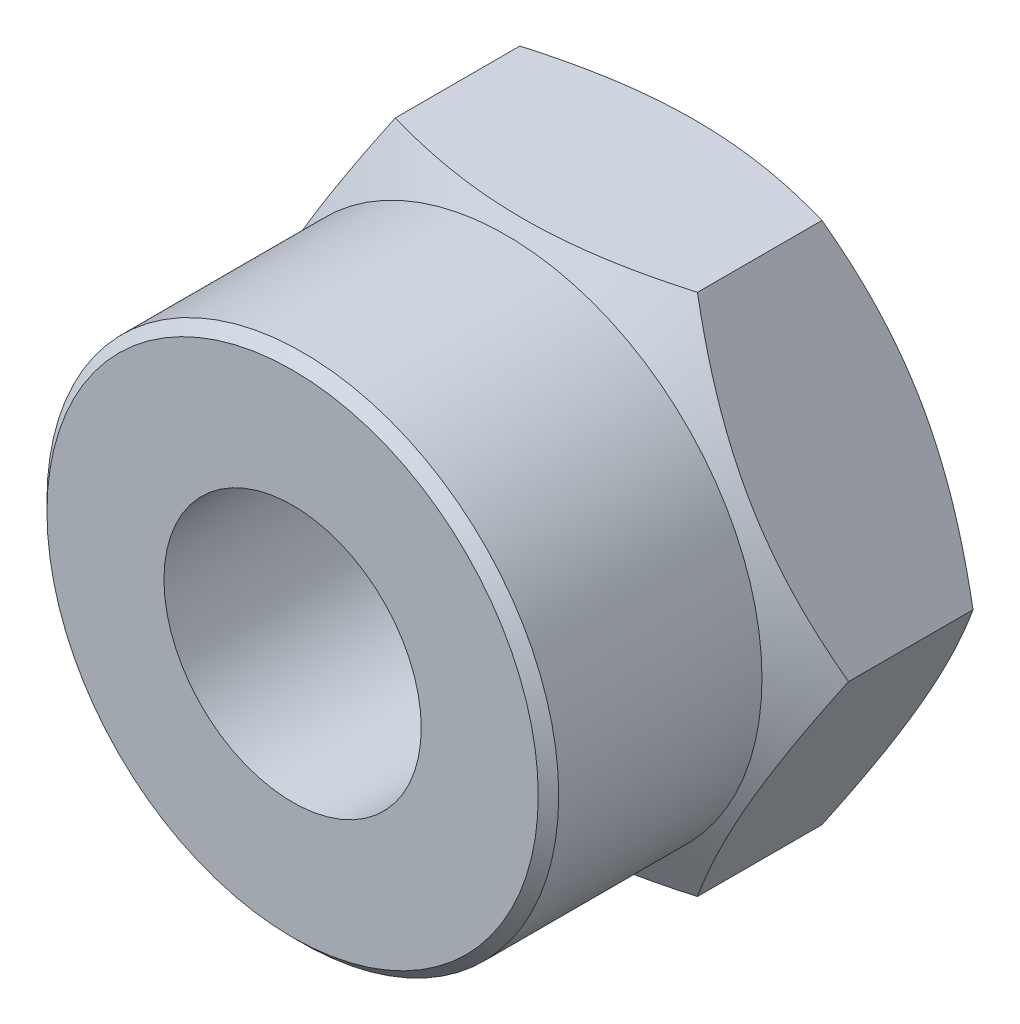
ISO-10303-21;
HEADER;
FILE_DESCRIPTION(('STEP AP214'),'2;1');
FILE_NAME('part.step','',(''),(''),'','','');
FILE_SCHEMA(('AUTOMOTIVE_DESIGN { 1 0 10303 214 1 1 1 1 }'));
ENDSEC;
DATA;
#1=APPLICATION_CONTEXT('core data for automotive mechanical design processes');
#2=APPLICATION_PROTOCOL_DEFINITION('international standard','automotive_design',2000,#1);
#3=PRODUCT_CONTEXT('',#1,'mechanical');
#4=PRODUCT('Part','Part','',(#3));
#5=PRODUCT_RELATED_PRODUCT_CATEGORY('part','',(#4));
#6=PRODUCT_DEFINITION_FORMATION('','',#4);
#7=PRODUCT_DEFINITION_CONTEXT('part definition',#1,'design');
#8=PRODUCT_DEFINITION('design','',#6,#7);
#9=PRODUCT_DEFINITION_SHAPE('','',#8);
#10=(LENGTH_UNIT() NAMED_UNIT(*) SI_UNIT(.MILLI.,.METRE.));
#11=(NAMED_UNIT(*) PLANE_ANGLE_UNIT() SI_UNIT($,.RADIAN.));
#12=(NAMED_UNIT(*) SI_UNIT($,.STERADIAN.) SOLID_ANGLE_UNIT());
#13=UNCERTAINTY_MEASURE_WITH_UNIT(LENGTH_MEASURE(1.E-05),#10,'distance_accuracy_value','');
#14=(GEOMETRIC_REPRESENTATION_CONTEXT(3) GLOBAL_UNCERTAINTY_ASSIGNED_CONTEXT((#13)) GLOBAL_UNIT_ASSIGNED_CONTEXT((#10,
#11,#12)) REPRESENTATION_CONTEXT('',''));
#15=CARTESIAN_POINT('',(0.,0.,0.));
#16=DIRECTION('',(0.,0.,1.));
#17=DIRECTION('',(1.,0.,0.));
#18=AXIS2_PLACEMENT_3D('',#15,#16,#17);
#19=CARTESIAN_POINT('',(2.88675134594812,-5.,-3.92));
#20=DIRECTION('',(0.,0.,1.));
#21=DIRECTION('',(1.,0.,0.));
#22=AXIS2_PLACEMENT_3D('',#19,#20,#21);
#23=PLANE('',#22);
#24=CARTESIAN_POINT('',(0.,0.,-3.92));
#25=DIRECTION('',(0.,0.,-1.));
#26=DIRECTION('',(-1.,0.,0.));
#27=AXIS2_PLACEMENT_3D('',#24,#25,#26);
#28=CIRCLE('',#27,4.44);
#29=CARTESIAN_POINT('',(-4.44,0.,-3.92));
#30=VERTEX_POINT('',#29);
#31=EDGE_CURVE('E261',#30,#30,#28,.T.);
#32=ORIENTED_EDGE('',*,*,#31,.T.);
#33=EDGE_LOOP('',(#32));
#34=FACE_BOUND('',#33,.T.);
#35=CARTESIAN_POINT('',(0.,0.,-3.92));
#36=DIRECTION('',(0.,0.,-1.));
#37=DIRECTION('',(-1.,0.,0.));
#38=AXIS2_PLACEMENT_3D('',#35,#36,#37);
#39=CIRCLE('',#38,3.375);
#40=CARTESIAN_POINT('',(-3.375,0.,-3.92));
#41=VERTEX_POINT('',#40);
#42=EDGE_CURVE('E274',#41,#41,#39,.T.);
#43=ORIENTED_EDGE('',*,*,#42,.F.);
#44=EDGE_LOOP('',(#43));
#45=FACE_BOUND('',#44,.T.);
#46=ADVANCED_FACE('F38',(#34,#45),#23,.F.);
#47=CARTESIAN_POINT('',(0.,0.,-3.92));
#48=DIRECTION('',(0.,0.,1.));
#49=DIRECTION('',(1.,0.,0.));
#50=AXIS2_PLACEMENT_3D('',#47,#48,#49);
#51=CYLINDRICAL_SURFACE('',#50,2.4585);
#52=CARTESIAN_POINT('',(0.,0.,4.08));
#53=DIRECTION('',(0.,0.,1.));
#54=DIRECTION('',(1.,0.,0.));
#55=AXIS2_PLACEMENT_3D('',#52,#53,#54);
#56=CIRCLE('',#55,2.4585);
#57=CARTESIAN_POINT('',(2.4585,0.,4.08));
#58=VERTEX_POINT('',#57);
#59=EDGE_CURVE('E270',#58,#58,#56,.T.);
#60=ORIENTED_EDGE('',*,*,#59,.T.);
#61=EDGE_LOOP('',(#60));
#62=FACE_BOUND('',#61,.T.);
#63=CARTESIAN_POINT('',(0.,0.,-3.00350000000001));
#64=DIRECTION('',(0.,0.,-1.));
#65=DIRECTION('',(-1.,0.,0.));
#66=AXIS2_PLACEMENT_3D('',#63,#64,#65);
#67=CIRCLE('',#66,2.4585);
#68=CARTESIAN_POINT('',(-2.4585,0.,-3.00350000000001));
#69=VERTEX_POINT('',#68);
#70=EDGE_CURVE('E278',#69,#69,#67,.T.);
#71=ORIENTED_EDGE('',*,*,#70,.T.);
#72=EDGE_LOOP('',(#71));
#73=FACE_BOUND('',#72,.T.);
#74=ADVANCED_FACE('F143',(#62,#73),#51,.F.);
#75=CARTESIAN_POINT('',(-2.88675134594814,-5.,-3.92));
#76=DIRECTION('',(0.,-1.,0.));
#77=DIRECTION('',(1.,0.,0.));
#78=AXIS2_PLACEMENT_3D('',#75,#76,#77);
#79=PLANE('',#78);
#80=DIRECTION('',(0.,0.,1.));
#81=VECTOR('',#80,1.);
#82=CARTESIAN_POINT('',(2.88675134594812,-5.,-3.92));
#83=LINE('',#82,#81);
#84=CARTESIAN_POINT('',(2.88675134594812,-5.,-3.15010186186862));
#85=VERTEX_POINT('',#84);
#86=CARTESIAN_POINT('',(2.88675134594812,-5.,-0.769898138131379));
#87=VERTEX_POINT('',#86);
#88=EDGE_CURVE('E124',#85,#87,#83,.T.);
#89=ORIENTED_EDGE('',*,*,#88,.T.);
#90=CARTESIAN_POINT('',(-7.61133668716137,-5.,-2.69433512326726));
#91=CARTESIAN_POINT('',(-7.39409738770426,-5.,-2.58953723763427));
#92=CARTESIAN_POINT('',(-7.17634372856759,-5.,-2.48578649625321));
#93=CARTESIAN_POINT('',(-6.73953354866842,-5.,-2.28097137090779));
#94=CARTESIAN_POINT('',(-6.52047681521267,-5.,-2.17990744108762));
#95=CARTESIAN_POINT('',(-6.07958758916233,-5.,-1.98051856264199));
#96=CARTESIAN_POINT('',(-5.85774636982578,-5.,-1.88221284088263));
#97=CARTESIAN_POINT('',(-5.41224849468732,-5.,-1.68982061241231));
#98=CARTESIAN_POINT('',(-5.18859192981343,-5.,-1.595733895899));
#99=CARTESIAN_POINT('',(-4.73248901719764,-5.,-1.41020630377685));
#100=CARTESIAN_POINT('',(-4.49997757426015,-5.,-1.318924549371));
#101=CARTESIAN_POINT('',(-4.0321822481483,-5.,-1.14362206092523));
#102=CARTESIAN_POINT('',(-3.79689804996629,-5.,-1.05960216110657));
#103=CARTESIAN_POINT('',(-3.32367155732806,-5.,-0.901134269385762));
#104=CARTESIAN_POINT('',(-3.08573626147812,-5.,-0.826665596003584));
#105=CARTESIAN_POINT('',(-2.60645726671837,-5.,-0.689783142305321));
#106=CARTESIAN_POINT('',(-2.36511471301518,-5.,-0.627365410430523));
#107=CARTESIAN_POINT('',(-1.8801814893902,-5.,-0.51799234765899));
#108=CARTESIAN_POINT('',(-1.63660860934163,-5.,-0.470959633630468));
#109=CARTESIAN_POINT('',(-1.14659013654857,-5.,-0.395115696230977));
#110=CARTESIAN_POINT('',(-0.900144772628942,-5.,-0.3663030314009));
#111=CARTESIAN_POINT('',(-0.408768194001602,-5.,-0.329576278020169));
#112=CARTESIAN_POINT('',(-0.163856692590137,-5.,-0.32140488230906));
#113=CARTESIAN_POINT('',(0.325786226351079,-5.,-0.325984309704955));
#114=CARTESIAN_POINT('',(0.570517637033507,-5.,-0.338735890983785));
#115=CARTESIAN_POINT('',(0.99035879622511,-5.,-0.37767978810792));
#116=CARTESIAN_POINT('',(1.16592937297277,-5.,-0.399156218516795));
#117=CARTESIAN_POINT('',(1.51568200336688,-5.,-0.451460030668724));
#118=CARTESIAN_POINT('',(1.68986384569662,-5.,-0.482288808656884));
#119=CARTESIAN_POINT('',(2.21015180041583,-5.,-0.587171988577793));
#120=CARTESIAN_POINT('',(2.55378565061376,-5.,-0.673600789995939));
#121=CARTESIAN_POINT('',(3.06746778580513,-5.,-0.822160430490619));
#122=CARTESIAN_POINT('',(3.24020914842915,-5.,-0.875498547120181));
#123=CARTESIAN_POINT('',(3.58401228359192,-5.,-0.987385425182782));
#124=CARTESIAN_POINT('',(3.75507404532942,-5.,-1.04593422010051));
#125=CARTESIAN_POINT('',(4.09557896002417,-5.,-1.16733055166735));
#126=CARTESIAN_POINT('',(4.26502269681175,-5.,-1.23017646541005));
#127=CARTESIAN_POINT('',(4.60252857502927,-5.,-1.3594606779971));
#128=CARTESIAN_POINT('',(4.77059072933414,-5.,-1.42589894332064));
#129=CARTESIAN_POINT('',(5.15259224872122,-5.,-1.58087327513494));
#130=CARTESIAN_POINT('',(5.36614137353593,-5.,-1.67036922031327));
#131=CARTESIAN_POINT('',(5.79156033981749,-5.,-1.85327689650939));
#132=CARTESIAN_POINT('',(6.00343010172991,-5.,-1.94668881173097));
#133=CARTESIAN_POINT('',(6.42578386601097,-5.,-2.13667712782812));
#134=CARTESIAN_POINT('',(6.6362676386368,-5.,-2.23325403822963));
#135=CARTESIAN_POINT('',(7.05604066448471,-5.,-2.42897336209076));
#136=CARTESIAN_POINT('',(7.26532989620768,-5.,-2.52811582154802));
#137=CARTESIAN_POINT('',(7.89204406647295,-5.,-2.82884556612059));
#138=CARTESIAN_POINT('',(8.30796108347818,-5.,-3.03357380687646));
#139=CARTESIAN_POINT('',(9.13690633310475,-5.,-3.44879636339914));
#140=CARTESIAN_POINT('',(9.54993447274692,-5.,-3.65929086369207));
#141=CARTESIAN_POINT('',(10.1518439339586,-5.,-3.96988306591477));
#142=CARTESIAN_POINT('',(10.3415719124748,-5.,-4.0683446758708));
#143=CARTESIAN_POINT('',(10.7206221930767,-5.,-4.26603822530517));
#144=CARTESIAN_POINT('',(10.9099445017637,-5.,-4.36527015212504));
#145=CARTESIAN_POINT('',(11.4773962380079,-5.,-4.66397649061342));
#146=CARTESIAN_POINT('',(11.8549973414581,-5.,-4.86445466466106));
#147=CARTESIAN_POINT('',(12.6082929441823,-5.,-5.26703409284126));
#148=CARTESIAN_POINT('',(12.9839897942355,-5.,-5.46913095625476));
#149=CARTESIAN_POINT('',(13.7344819018994,-5.,-5.87495015123198));
#150=CARTESIAN_POINT('',(14.109277201462,-5.,-6.07867240517967));
#151=CARTESIAN_POINT('',(14.4837363147315,-5.,-6.2830069829596));
#152=B_SPLINE_CURVE_WITH_KNOTS('',3,(#90,#91,#92,#93,#94,#95,#96,#97,#98,#99,#100,#101,#102,
#103,#104,#105,#106,#107,#108,#109,#110,#111,#112,#113,#114,#115,#116,#117,#118,#119,#120,#121,
#122,#123,#124,#125,#126,#127,#128,#129,#130,#131,#132,#133,#134,#135,#136,#137,#138,#139,#140,
#141,#142,#143,#144,#145,#146,#147,#148,#149,#150,#151),.UNSPECIFIED.,.F.,.F.,(4,2,2,2,2,2,2,2,
2,2,2,2,2,2,2,2,2,2,2,2,2,2,2,2,2,2,2,2,2,2,4),(0.,0.723597571978046,1.44731668385172,
2.1752224425821,2.90309196384164,3.65236162209631,4.4017172402364,5.14942183795601,
5.89688084196657,6.6405203243735,7.38410096719972,8.11836559070016,8.85265682184087,
9.38303444584098,9.91349129079581,10.975049662432,11.5173740957594,12.0597020144055,
12.6018262297855,13.1439453873877,13.838526942959,14.5331412077794,15.2278678517969,
15.9226069601879,17.3132532010798,18.7039439961602,19.3452089174842,19.986463323232,
21.2690164981463,22.5488254136018,23.8285735768008),.UNSPECIFIED.);
#153=CARTESIAN_POINT('',(-2.88675134594814,-4.99999999999998,-0.769898138131378));
#154=VERTEX_POINT('',#153);
#155=EDGE_CURVE('E53',#87,#154,#152,.F.);
#156=ORIENTED_EDGE('',*,*,#155,.T.);
#157=DIRECTION('',(0.,0.,1.));
#158=VECTOR('',#157,1.);
#159=CARTESIAN_POINT('',(-2.88675134594814,-5.,-3.92));
#160=LINE('',#159,#158);
#161=CARTESIAN_POINT('',(-2.88675134594814,-4.99999999999998,-3.15010186186862));
#162=VERTEX_POINT('',#161);
#163=EDGE_CURVE('E107',#162,#154,#160,.T.);
#164=ORIENTED_EDGE('',*,*,#163,.F.);
#165=CARTESIAN_POINT('',(-7.61133668716137,-5.,-1.22566487673273));
#166=CARTESIAN_POINT('',(-7.39409738770426,-5.,-1.33046276236572));
#167=CARTESIAN_POINT('',(-7.17634372856759,-5.,-1.43421350374679));
#168=CARTESIAN_POINT('',(-6.73953354866841,-5.,-1.63902862909221));
#169=CARTESIAN_POINT('',(-6.52047681521267,-5.,-1.74009255891238));
#170=CARTESIAN_POINT('',(-6.07958758916233,-5.,-1.93948143735801));
#171=CARTESIAN_POINT('',(-5.85774636982578,-5.,-2.03778715911737));
#172=CARTESIAN_POINT('',(-5.41224849468732,-5.,-2.23017938758769));
#173=CARTESIAN_POINT('',(-5.18859192981342,-5.,-2.324266104101));
#174=CARTESIAN_POINT('',(-4.73248901719764,-5.,-2.50979369622315));
#175=CARTESIAN_POINT('',(-4.49997757426015,-5.,-2.601075450629));
#176=CARTESIAN_POINT('',(-4.0321822481483,-5.,-2.77637793907477));
#177=CARTESIAN_POINT('',(-3.79689804996629,-5.,-2.86039783889343));
#178=CARTESIAN_POINT('',(-3.32367155732806,-5.,-3.01886573061424));
#179=CARTESIAN_POINT('',(-3.08573626147812,-5.,-3.09333440399641));
#180=CARTESIAN_POINT('',(-2.60645726671837,-5.,-3.23021685769468));
#181=CARTESIAN_POINT('',(-2.36511471301518,-5.,-3.29263458956948));
#182=CARTESIAN_POINT('',(-1.8801814893902,-5.,-3.40200765234101));
#183=CARTESIAN_POINT('',(-1.63660860934163,-5.,-3.44904036636953));
#184=CARTESIAN_POINT('',(-1.14659013654857,-5.,-3.52488430376902));
#185=CARTESIAN_POINT('',(-0.900144772628943,-5.,-3.5536969685991));
#186=CARTESIAN_POINT('',(-0.408768194001603,-5.,-3.59042372197983));
#187=CARTESIAN_POINT('',(-0.163856692590138,-5.,-3.59859511769094));
#188=CARTESIAN_POINT('',(0.325786226351078,-5.,-3.59401569029504));
#189=CARTESIAN_POINT('',(0.570517637033507,-5.,-3.58126410901621));
#190=CARTESIAN_POINT('',(0.99035879622511,-5.,-3.54232021189208));
#191=CARTESIAN_POINT('',(1.16592937297277,-5.,-3.5208437814832));
#192=CARTESIAN_POINT('',(1.51568200336688,-5.,-3.46853996933127));
#193=CARTESIAN_POINT('',(1.68986384569662,-5.,-3.43771119134311));
#194=CARTESIAN_POINT('',(2.21015180041583,-5.,-3.33282801142221));
#195=CARTESIAN_POINT('',(2.55378565061376,-5.,-3.24639921000406));
#196=CARTESIAN_POINT('',(3.06746778580512,-5.,-3.09783956950938));
#197=CARTESIAN_POINT('',(3.24020914842914,-5.,-3.04450145287982));
#198=CARTESIAN_POINT('',(3.58401228359191,-5.,-2.93261457481722));
#199=CARTESIAN_POINT('',(3.75507404532941,-5.,-2.8740657798995));
#200=CARTESIAN_POINT('',(4.09557896002416,-5.,-2.75266944833265));
#201=CARTESIAN_POINT('',(4.26502269681173,-5.,-2.68982353458995));
#202=CARTESIAN_POINT('',(4.60252857502925,-5.,-2.5605393220029));
#203=CARTESIAN_POINT('',(4.77059072933413,-5.,-2.49410105667937));
#204=CARTESIAN_POINT('',(5.15259224872121,-5.,-2.33912672486506));
#205=CARTESIAN_POINT('',(5.36614137353592,-5.,-2.24963077968673));
#206=CARTESIAN_POINT('',(5.79156033981747,-5.,-2.06672310349061));
#207=CARTESIAN_POINT('',(6.00343010172989,-5.,-1.97331118826903));
#208=CARTESIAN_POINT('',(6.42578386601096,-5.,-1.78332287217188));
#209=CARTESIAN_POINT('',(6.63626763863679,-5.,-1.68674596177037));
#210=CARTESIAN_POINT('',(7.0560406644847,-5.,-1.49102663790924));
#211=CARTESIAN_POINT('',(7.26532989620766,-5.,-1.39188417845198));
#212=CARTESIAN_POINT('',(7.89204406647293,-5.,-1.09115443387941));
#213=CARTESIAN_POINT('',(8.30796108347816,-5.,-0.886426193123544));
#214=CARTESIAN_POINT('',(9.13690633310473,-5.,-0.471203636600865));
#215=CARTESIAN_POINT('',(9.5499344727469,-5.,-0.260709136307933));
#216=CARTESIAN_POINT('',(10.1518439339585,-5.,0.0498830659147642));
#217=CARTESIAN_POINT('',(10.3415719124748,-5.,0.148344675870795));
#218=CARTESIAN_POINT('',(10.7206221930767,-5.,0.346038225305172));
#219=CARTESIAN_POINT('',(10.9099445017637,-5.,0.445270152125041));
#220=CARTESIAN_POINT('',(11.4773962380079,-5.,0.743976490613418));
#221=CARTESIAN_POINT('',(11.8549973414581,-5.,0.94445466466106));
#222=CARTESIAN_POINT('',(12.6082929441823,-5.,1.34703409284126));
#223=CARTESIAN_POINT('',(12.9839897942355,-5.,1.54913095625476));
#224=CARTESIAN_POINT('',(13.7344819018994,-5.,1.95495015123199));
#225=CARTESIAN_POINT('',(14.1092772014619,-5.,2.15867240517968));
#226=CARTESIAN_POINT('',(14.4837363147315,-5.,2.36300698295961));
#227=B_SPLINE_CURVE_WITH_KNOTS('',3,(#165,#166,#167,#168,#169,#170,#171,#172,#173,#174,#175,
#176,#177,#178,#179,#180,#181,#182,#183,#184,#185,#186,#187,#188,#189,#190,#191,#192,#193,#194,
#195,#196,#197,#198,#199,#200,#201,#202,#203,#204,#205,#206,#207,#208,#209,#210,#211,#212,#213,
#214,#215,#216,#217,#218,#219,#220,#221,#222,#223,#224,#225,#226),.UNSPECIFIED.,.F.,.F.,(4,2,2,
2,2,2,2,2,2,2,2,2,2,2,2,2,2,2,2,2,2,2,2,2,2,2,2,2,2,2,4),(0.,0.723597571978048,1.44731668385172,
2.1752224425821,2.90309196384164,3.65236162209631,4.40171724023641,5.14942183795602,
5.89688084196658,6.64052032437351,7.38410096719973,8.11836559070016,8.85265682184088,
9.38303444584098,9.91349129079581,10.975049662432,11.5173740957594,12.0597020144055,
12.6018262297855,13.1439453873877,13.8385269429589,14.5331412077794,15.2278678517968,
15.9226069601878,17.3132532010798,18.7039439961601,19.3452089174842,19.986463323232,
21.2690164981463,22.5488254136018,23.8285735768008),.UNSPECIFIED.);
#228=EDGE_CURVE('E126',#162,#85,#227,.T.);
#229=ORIENTED_EDGE('',*,*,#228,.T.);
#230=EDGE_LOOP('',(#89,#156,#164,#229));
#231=FACE_BOUND('',#230,.T.);
#232=ADVANCED_FACE('F149',(#231),#79,.T.);
#233=CARTESIAN_POINT('',(-5.77350269189627,0.,-3.92));
#234=DIRECTION('',(-0.866025403784438,-0.5,0.));
#235=DIRECTION('',(0.5,-0.866025403784439,0.));
#236=AXIS2_PLACEMENT_3D('',#233,#234,#235);
#237=PLANE('',#236);
#238=ORIENTED_EDGE('',*,*,#163,.T.);
#239=CARTESIAN_POINT('',(-2.8866358758943,-5.0002,-0.76996480679801));
#240=CARTESIAN_POINT('',(-3.01349970319369,-4.78046540547481,-0.696702718383817));
#241=CARTESIAN_POINT('',(-3.1414485999385,-4.55885141554042,-0.630067472664274));
#242=CARTESIAN_POINT('',(-3.39956193532121,-4.11178600454649,-0.513755141756995));
#243=CARTESIAN_POINT('',(-3.52973095989718,-3.88632664040923,-0.464119200661974));
#244=CARTESIAN_POINT('',(-3.78847564779798,-3.43816769477649,-0.386867176164884));
#245=CARTESIAN_POINT('',(-3.91701101576052,-3.21553790689581,-0.358736529029675));
#246=CARTESIAN_POINT('',(-4.11026620624323,-2.88081009815336,-0.333511072699872));
#247=CARTESIAN_POINT('',(-4.17472868879311,-2.76915780319494,-0.327929610515672));
#248=CARTESIAN_POINT('',(-4.30371322717528,-2.5457500293262,-0.322518367497658));
#249=CARTESIAN_POINT('',(-4.36823528110589,-2.43399455370969,-0.322688409004391));
#250=CARTESIAN_POINT('',(-4.54500768479195,-2.12781576914936,-0.331069782538224));
#251=CARTESIAN_POINT('',(-4.65719946015293,-1.93349391403279,-0.34514592264344));
#252=CARTESIAN_POINT('',(-4.88083840557982,-1.54613989800229,-0.389781407855619));
#253=CARTESIAN_POINT('',(-4.99228478956021,-1.35310909862843,-0.420356010893696));
#254=CARTESIAN_POINT('',(-5.21637431361296,-0.964974657525146,-0.496784644367351));
#255=CARTESIAN_POINT('',(-5.32898917185759,-0.769920001358264,-0.542962529624867));
#256=CARTESIAN_POINT('',(-5.55253939626499,-0.382719654641231,-0.64776794523812));
#257=CARTESIAN_POINT('',(-5.66347762579592,-0.190569004591913,-0.706370854183559));
#258=CARTESIAN_POINT('',(-5.7736181619501,0.000200000000000653,-0.769964806798013));
#259=B_SPLINE_CURVE_WITH_KNOTS('',3,(#239,#240,#241,#242,#243,#244,#245,#246,#247,#248,#249,
#250,#251,#252,#253,#254,#255,#256,#257,#258),.UNSPECIFIED.,.F.,.F.,(4,2,2,2,2,2,2,2,2,4),(0.,
0.792555841363091,1.58701660053333,2.3618153748728,2.74884076077325,3.13585419177295,
3.80962362599679,4.48401723901189,5.17336882348928,5.86136694793725),.UNSPECIFIED.);
#260=CARTESIAN_POINT('',(-5.77350269189625,0.,-0.769898138131378));
#261=VERTEX_POINT('',#260);
#262=EDGE_CURVE('E92',#154,#261,#259,.T.);
#263=ORIENTED_EDGE('',*,*,#262,.T.);
#264=DIRECTION('',(0.,0.,1.));
#265=VECTOR('',#264,1.);
#266=CARTESIAN_POINT('',(-5.77350269189627,0.,-3.92));
#267=LINE('',#266,#265);
#268=CARTESIAN_POINT('',(-5.77350269189625,0.,-3.15010186186862));
#269=VERTEX_POINT('',#268);
#270=EDGE_CURVE('E105',#269,#261,#267,.T.);
#271=ORIENTED_EDGE('',*,*,#270,.F.);
#272=CARTESIAN_POINT('',(-5.7736181619501,0.000200000000001004,-3.15003519320198));
#273=CARTESIAN_POINT('',(-5.64675433465071,-0.219534594525184,-3.22329728161618));
#274=CARTESIAN_POINT('',(-5.5188054379059,-0.44114858445958,-3.28993252733572));
#275=CARTESIAN_POINT('',(-5.26069210252319,-0.888213995453513,-3.406244858243));
#276=CARTESIAN_POINT('',(-5.13052307794722,-1.11367335959077,-3.45588079933802));
#277=CARTESIAN_POINT('',(-4.87177839004642,-1.56183230522351,-3.53313282383511));
#278=CARTESIAN_POINT('',(-4.74324302208388,-1.78446209310419,-3.56126347097032));
#279=CARTESIAN_POINT('',(-4.54998783160117,-2.11918990184664,-3.58648892730013));
#280=CARTESIAN_POINT('',(-4.48552534905129,-2.23084219680506,-3.59207038948433));
#281=CARTESIAN_POINT('',(-4.35654081066912,-2.4542499706738,-3.59748163250234));
#282=CARTESIAN_POINT('',(-4.29201875673851,-2.56600544629032,-3.59731159099561));
#283=CARTESIAN_POINT('',(-4.11524635305245,-2.87218423085064,-3.58893021746177));
#284=CARTESIAN_POINT('',(-4.00305457769147,-3.06650608596721,-3.57485407735656));
#285=CARTESIAN_POINT('',(-3.77941563226458,-3.45386010199771,-3.53021859214438));
#286=CARTESIAN_POINT('',(-3.66796924828419,-3.64689090137157,-3.4996439891063));
#287=CARTESIAN_POINT('',(-3.44387972423144,-4.03502534247485,-3.42321535563265));
#288=CARTESIAN_POINT('',(-3.33126486598681,-4.23007999864174,-3.37703747037513));
#289=CARTESIAN_POINT('',(-3.10771464157941,-4.61728034535877,-3.27223205476188));
#290=CARTESIAN_POINT('',(-2.99677641204848,-4.80943099540809,-3.21362914581644));
#291=CARTESIAN_POINT('',(-2.8866358758943,-5.0002,-3.15003519320199));
#292=B_SPLINE_CURVE_WITH_KNOTS('',3,(#272,#273,#274,#275,#276,#277,#278,#279,#280,#281,#282,
#283,#284,#285,#286,#287,#288,#289,#290,#291),.UNSPECIFIED.,.F.,.F.,(4,2,2,2,2,2,2,2,2,4),(0.,
0.792555841363091,1.58701660053333,2.36181537487281,2.74884076077326,3.13585419177295,
3.80962362599679,4.48401723901189,5.17336882348929,5.86136694793725),.UNSPECIFIED.);
#293=EDGE_CURVE('E163',#269,#162,#292,.T.);
#294=ORIENTED_EDGE('',*,*,#293,.T.);
#295=EDGE_LOOP('',(#238,#263,#271,#294));
#296=FACE_BOUND('',#295,.T.);
#297=ADVANCED_FACE('F103',(#296),#237,.T.);
#298=CARTESIAN_POINT('',(-2.88675134594814,5.,-3.92));
#299=DIRECTION('',(-0.866025403784439,0.5,0.));
#300=DIRECTION('',(-0.5,-0.866025403784439,0.));
#301=AXIS2_PLACEMENT_3D('',#298,#299,#300);
#302=PLANE('',#301);
#303=ORIENTED_EDGE('',*,*,#270,.T.);
#304=CARTESIAN_POINT('',(-5.7736181619501,-0.000199999999999035,-0.769964806798013));
#305=CARTESIAN_POINT('',(-5.64675433465072,0.219534594525187,-0.69670271838382));
#306=CARTESIAN_POINT('',(-5.5188054379059,0.441148584459582,-0.630067472664278));
#307=CARTESIAN_POINT('',(-5.26069210252319,0.888213995453515,-0.513755141756998));
#308=CARTESIAN_POINT('',(-5.13052307794722,1.11367335959078,-0.464119200661977));
#309=CARTESIAN_POINT('',(-4.87177839004642,1.56183230522351,-0.386867176164886));
#310=CARTESIAN_POINT('',(-4.74324302208388,1.78446209310419,-0.358736529029678));
#311=CARTESIAN_POINT('',(-4.54998783160117,2.11918990184664,-0.333511072699873));
#312=CARTESIAN_POINT('',(-4.48552534905129,2.23084219680506,-0.327929610515672));
#313=CARTESIAN_POINT('',(-4.35654081066912,2.4542499706738,-0.322518367497659));
#314=CARTESIAN_POINT('',(-4.29201875673851,2.56600544629032,-0.322688409004392));
#315=CARTESIAN_POINT('',(-4.11524635305245,2.87218423085064,-0.331069782538225));
#316=CARTESIAN_POINT('',(-4.00305457769147,3.06650608596722,-0.34514592264344));
#317=CARTESIAN_POINT('',(-3.77941563226458,3.45386010199771,-0.389781407855619));
#318=CARTESIAN_POINT('',(-3.66796924828419,3.64689090137157,-0.420356010893695));
#319=CARTESIAN_POINT('',(-3.44387972423145,4.03502534247486,-0.49678464436735));
#320=CARTESIAN_POINT('',(-3.33126486598681,4.23007999864174,-0.542962529624865));
#321=CARTESIAN_POINT('',(-3.10771464157941,4.61728034535877,-0.647767945238118));
#322=CARTESIAN_POINT('',(-2.99677641204848,4.80943099540809,-0.706370854183557));
#323=CARTESIAN_POINT('',(-2.8866358758943,5.0002,-0.769964806798011));
#324=B_SPLINE_CURVE_WITH_KNOTS('',3,(#304,#305,#306,#307,#308,#309,#310,#311,#312,#313,#314,
#315,#316,#317,#318,#319,#320,#321,#322,#323),.UNSPECIFIED.,.F.,.F.,(4,2,2,2,2,2,2,2,2,4),(0.,
0.792555841363091,1.58701660053333,2.36181537487281,2.74884076077325,3.13585419177295,
3.80962362599679,4.48401723901189,5.17336882348928,5.86136694793725),.UNSPECIFIED.);
#325=CARTESIAN_POINT('',(-2.88675134594811,5.,-0.769898138131378));
#326=VERTEX_POINT('',#325);
#327=EDGE_CURVE('E89',#261,#326,#324,.T.);
#328=ORIENTED_EDGE('',*,*,#327,.T.);
#329=DIRECTION('',(0.,0.,1.));
#330=VECTOR('',#329,1.);
#331=CARTESIAN_POINT('',(-2.88675134594814,5.,-3.92));
#332=LINE('',#331,#330);
#333=CARTESIAN_POINT('',(-2.88675134594811,5.,-3.15010186186862));
#334=VERTEX_POINT('',#333);
#335=EDGE_CURVE('E112',#334,#326,#332,.T.);
#336=ORIENTED_EDGE('',*,*,#335,.F.);
#337=CARTESIAN_POINT('',(-2.8866358758943,5.0002,-3.15003519320199));
#338=CARTESIAN_POINT('',(-3.01349970319369,4.78046540547482,-3.22329728161618));
#339=CARTESIAN_POINT('',(-3.1414485999385,4.55885141554042,-3.28993252733572));
#340=CARTESIAN_POINT('',(-3.39956193532122,4.11178600454649,-3.406244858243));
#341=CARTESIAN_POINT('',(-3.52973095989718,3.88632664040923,-3.45588079933802));
#342=CARTESIAN_POINT('',(-3.78847564779798,3.43816769477649,-3.53313282383511));
#343=CARTESIAN_POINT('',(-3.91701101576053,3.21553790689581,-3.56126347097032));
#344=CARTESIAN_POINT('',(-4.11026620624323,2.88081009815336,-3.58648892730013));
#345=CARTESIAN_POINT('',(-4.17472868879311,2.76915780319494,-3.59207038948433));
#346=CARTESIAN_POINT('',(-4.30371322717528,2.5457500293262,-3.59748163250234));
#347=CARTESIAN_POINT('',(-4.3682352811059,2.43399455370969,-3.59731159099561));
#348=CARTESIAN_POINT('',(-4.54500768479195,2.12781576914936,-3.58893021746177));
#349=CARTESIAN_POINT('',(-4.65719946015293,1.93349391403279,-3.57485407735656));
#350=CARTESIAN_POINT('',(-4.88083840557982,1.5461398980023,-3.53021859214438));
#351=CARTESIAN_POINT('',(-4.99228478956021,1.35310909862843,-3.4996439891063));
#352=CARTESIAN_POINT('',(-5.21637431361296,0.964974657525147,-3.42321535563265));
#353=CARTESIAN_POINT('',(-5.32898917185759,0.769920001358265,-3.37703747037513));
#354=CARTESIAN_POINT('',(-5.55253939626499,0.382719654641232,-3.27223205476188));
#355=CARTESIAN_POINT('',(-5.66347762579593,0.190569004591913,-3.21362914581644));
#356=CARTESIAN_POINT('',(-5.7736181619501,-0.000199999999999278,-3.15003519320198));
#357=B_SPLINE_CURVE_WITH_KNOTS('',3,(#337,#338,#339,#340,#341,#342,#343,#344,#345,#346,#347,
#348,#349,#350,#351,#352,#353,#354,#355,#356),.UNSPECIFIED.,.F.,.F.,(4,2,2,2,2,2,2,2,2,4),(0.,
0.792555841363091,1.58701660053333,2.36181537487281,2.74884076077325,3.13585419177295,
3.80962362599679,4.48401723901189,5.17336882348928,5.86136694793725),.UNSPECIFIED.);
#358=EDGE_CURVE('E111',#334,#269,#357,.T.);
#359=ORIENTED_EDGE('',*,*,#358,.T.);
#360=EDGE_LOOP('',(#303,#328,#336,#359));
#361=FACE_BOUND('',#360,.T.);
#362=ADVANCED_FACE('F110',(#361),#302,.T.);
#363=CARTESIAN_POINT('',(2.88675134594812,5.,-3.92));
#364=DIRECTION('',(0.,1.,0.));
#365=DIRECTION('',(0.,0.,1.));
#366=AXIS2_PLACEMENT_3D('',#363,#364,#365);
#367=PLANE('',#366);
#368=ORIENTED_EDGE('',*,*,#335,.T.);
#369=CARTESIAN_POINT('',(-7.61133668713975,5.,-2.69433512325683));
#370=CARTESIAN_POINT('',(-7.39409738768337,5.,-2.58953723762428));
#371=CARTESIAN_POINT('',(-7.17634372854742,5.,-2.48578649624366));
#372=CARTESIAN_POINT('',(-6.7395335486497,5.,-2.28097137089911));
#373=CARTESIAN_POINT('',(-6.52047681519469,5.,-2.17990744107938));
#374=CARTESIAN_POINT('',(-6.07958758914581,5.,-1.98051856263463));
#375=CARTESIAN_POINT('',(-5.85774636981001,5.,-1.8822128408757));
#376=CARTESIAN_POINT('',(-5.41224849467303,5.,-1.68982061240625));
#377=CARTESIAN_POINT('',(-5.18859192979988,5.,-1.59573389589337));
#378=CARTESIAN_POINT('',(-4.73248901718563,5.,-1.41020630377209));
#379=CARTESIAN_POINT('',(-4.49997757424893,5.,-1.31892454936667));
#380=CARTESIAN_POINT('',(-4.03218224813869,5.,-1.14362206092175));
#381=CARTESIAN_POINT('',(-3.79689804995748,5.,-1.0596021611035));
#382=CARTESIAN_POINT('',(-3.32367155732089,5.,-0.901134269383477));
#383=CARTESIAN_POINT('',(-3.08573626147177,5.,-0.82666559600167));
#384=CARTESIAN_POINT('',(-2.60645726671369,5.,-0.689783142304084));
#385=CARTESIAN_POINT('',(-2.36511471301134,5.,-0.627365410429593));
#386=CARTESIAN_POINT('',(-1.88018148938851,5.,-0.517992347658675));
#387=CARTESIAN_POINT('',(-1.63660860934125,5.,-0.470959633630435));
#388=CARTESIAN_POINT('',(-1.14659013655084,5.,-0.395115696231305));
#389=CARTESIAN_POINT('',(-0.900144772632547,5.,-0.366303031401309));
#390=CARTESIAN_POINT('',(-0.408768194007859,5.,-0.329576278020502));
#391=CARTESIAN_POINT('',(-0.163856692597709,5.,-0.321404882309242));
#392=CARTESIAN_POINT('',(0.325786226340903,5.,-0.325984309704611));
#393=CARTESIAN_POINT('',(0.570517637022041,5.,-0.338735890983067));
#394=CARTESIAN_POINT('',(0.990358796211984,5.,-0.377679788106455));
#395=CARTESIAN_POINT('',(1.16592937295926,5.,-0.399156218515029));
#396=CARTESIAN_POINT('',(1.51568200335261,5.,-0.45146003066634));
#397=CARTESIAN_POINT('',(1.68986384568199,5.,-0.482288808654182));
#398=CARTESIAN_POINT('',(2.21015180040012,5.,-0.587171988574133));
#399=CARTESIAN_POINT('',(2.55378565059735,5.,-0.673600789991629));
#400=CARTESIAN_POINT('',(3.06746778578767,5.,-0.82216043048535));
#401=CARTESIAN_POINT('',(3.24020914841134,5.,-0.87549854711459));
#402=CARTESIAN_POINT('',(3.5840122835734,5.,-0.987385425176554));
#403=CARTESIAN_POINT('',(3.75507404531055,5.,-1.04593422009397));
#404=CARTESIAN_POINT('',(4.09557896000461,5.,-1.16733055166019));
#405=CARTESIAN_POINT('',(4.26502269679183,5.,-1.23017646540259));
#406=CARTESIAN_POINT('',(4.60252857500865,5.,-1.35946067798904));
#407=CARTESIAN_POINT('',(4.77059072931318,5.,-1.42589894331228));
#408=CARTESIAN_POINT('',(5.15259224870001,5.,-1.58087327512614));
#409=CARTESIAN_POINT('',(5.36614137351481,5.,-1.67036922030434));
#410=CARTESIAN_POINT('',(5.79156033979653,5.,-1.85327689650022));
#411=CARTESIAN_POINT('',(6.00343010170902,5.,-1.94668881172171));
#412=CARTESIAN_POINT('',(6.42578386599024,5.,-2.13667712781867));
#413=CARTESIAN_POINT('',(6.63626763861614,5.,-2.2332540382201));
#414=CARTESIAN_POINT('',(7.05604066446419,5.,-2.42897336208109));
#415=CARTESIAN_POINT('',(7.26532989618722,5.,-2.52811582153829));
#416=CARTESIAN_POINT('',(7.89204406645267,5.,-2.82884556611069));
#417=CARTESIAN_POINT('',(8.30796108345802,5.,-3.03357380686648));
#418=CARTESIAN_POINT('',(9.1369063330848,5.,-3.44879636338903));
#419=CARTESIAN_POINT('',(9.54993447272707,5.,-3.65929086368191));
#420=CARTESIAN_POINT('',(10.1518439339388,5.,-3.96988306590454));
#421=CARTESIAN_POINT('',(10.3415719124551,5.,-4.06834467586054));
#422=CARTESIAN_POINT('',(10.720622193057,5.,-4.26603822529485));
#423=CARTESIAN_POINT('',(10.909944501744,5.,-4.36527015211469));
#424=CARTESIAN_POINT('',(11.4773962379882,5.,-4.66397649060299));
#425=CARTESIAN_POINT('',(11.8549973414385,5.,-4.86445466465058));
#426=CARTESIAN_POINT('',(12.6082929441626,5.,-5.26703409283068));
#427=CARTESIAN_POINT('',(12.9839897942158,5.,-5.46913095624414));
#428=CARTESIAN_POINT('',(13.7344819018797,5.,-5.87495015122128));
#429=CARTESIAN_POINT('',(14.1092772014422,5.,-6.07867240516893));
#430=CARTESIAN_POINT('',(14.4837363147117,5.,-6.28300698294883));
#431=B_SPLINE_CURVE_WITH_KNOTS('',3,(#369,#370,#371,#372,#373,#374,#375,#376,#377,#378,#379,
#380,#381,#382,#383,#384,#385,#386,#387,#388,#389,#390,#391,#392,#393,#394,#395,#396,#397,#398,
#399,#400,#401,#402,#403,#404,#405,#406,#407,#408,#409,#410,#411,#412,#413,#414,#415,#416,#417,
#418,#419,#420,#421,#422,#423,#424,#425,#426,#427,#428,#429,#430),.UNSPECIFIED.,.F.,.F.,(4,2,2,
2,2,2,2,2,2,2,2,2,2,2,2,2,2,2,2,2,2,2,2,2,2,2,2,2,2,2,4),(0.,0.723597571975517,1.44731668384666,
2.17522244257448,2.90309196383146,3.65236162208343,4.40171724022083,5.14942183793775,
5.89688084194563,6.64052032434855,7.38410096717077,8.1183655906673,8.8526568218041,
9.38303444580295,9.91349129075653,10.9750496623902,11.5173740957163,12.0597020143611,
12.6018262297398,13.1439453873407,13.8385269429121,14.5331412077326,15.2278678517501,
15.9226069601412,17.3132532010334,18.7039439961139,19.345208917438,19.9864633231857,
21.2690164981,22.5488254135554,23.8285735767543),.UNSPECIFIED.);
#432=CARTESIAN_POINT('',(2.88675134594812,4.99999999999999,-0.769898138131378));
#433=VERTEX_POINT('',#432);
#434=EDGE_CURVE('E94',#326,#433,#431,.T.);
#435=ORIENTED_EDGE('',*,*,#434,.T.);
#436=DIRECTION('',(0.,0.,1.));
#437=VECTOR('',#436,1.);
#438=CARTESIAN_POINT('',(2.88675134594812,5.,-3.92));
#439=LINE('',#438,#437);
#440=CARTESIAN_POINT('',(2.88675134594812,5.,-3.15010186186862));
#441=VERTEX_POINT('',#440);
#442=EDGE_CURVE('E115',#441,#433,#439,.T.);
#443=ORIENTED_EDGE('',*,*,#442,.F.);
#444=CARTESIAN_POINT('',(-7.61133668713975,5.,-1.22566487674316));
#445=CARTESIAN_POINT('',(-7.39409738768337,5.,-1.33046276237571));
#446=CARTESIAN_POINT('',(-7.17634372854742,5.,-1.43421350375634));
#447=CARTESIAN_POINT('',(-6.7395335486497,5.,-1.63902862910088));
#448=CARTESIAN_POINT('',(-6.52047681519469,5.,-1.74009255892061));
#449=CARTESIAN_POINT('',(-6.07958758914581,5.,-1.93948143736537));
#450=CARTESIAN_POINT('',(-5.85774636981001,5.,-2.03778715912429));
#451=CARTESIAN_POINT('',(-5.41224849467303,5.,-2.23017938759375));
#452=CARTESIAN_POINT('',(-5.18859192979988,5.,-2.32426610410663));
#453=CARTESIAN_POINT('',(-4.73248901718563,5.,-2.50979369622791));
#454=CARTESIAN_POINT('',(-4.49997757424894,5.,-2.60107545063333));
#455=CARTESIAN_POINT('',(-4.03218224813869,5.,-2.77637793907825));
#456=CARTESIAN_POINT('',(-3.79689804995748,5.,-2.8603978388965));
#457=CARTESIAN_POINT('',(-3.32367155732089,5.,-3.01886573061652));
#458=CARTESIAN_POINT('',(-3.08573626147177,5.,-3.09333440399833));
#459=CARTESIAN_POINT('',(-2.60645726671369,5.,-3.23021685769591));
#460=CARTESIAN_POINT('',(-2.36511471301134,5.,-3.29263458957041));
#461=CARTESIAN_POINT('',(-1.88018148938851,5.,-3.40200765234132));
#462=CARTESIAN_POINT('',(-1.63660860934125,5.,-3.44904036636956));
#463=CARTESIAN_POINT('',(-1.14659013655084,5.,-3.52488430376869));
#464=CARTESIAN_POINT('',(-0.900144772632548,5.,-3.55369696859869));
#465=CARTESIAN_POINT('',(-0.40876819400786,5.,-3.5904237219795));
#466=CARTESIAN_POINT('',(-0.163856692597709,5.,-3.59859511769076));
#467=CARTESIAN_POINT('',(0.325786226340902,5.,-3.59401569029539));
#468=CARTESIAN_POINT('',(0.57051763702204,5.,-3.58126410901693));
#469=CARTESIAN_POINT('',(0.990358796211984,5.,-3.54232021189354));
#470=CARTESIAN_POINT('',(1.16592937295926,5.,-3.52084378148497));
#471=CARTESIAN_POINT('',(1.51568200335262,5.,-3.46853996933366));
#472=CARTESIAN_POINT('',(1.68986384568199,5.,-3.43771119134582));
#473=CARTESIAN_POINT('',(2.21015180040012,5.,-3.33282801142587));
#474=CARTESIAN_POINT('',(2.55378565059735,5.,-3.24639921000837));
#475=CARTESIAN_POINT('',(3.06746778578767,5.,-3.09783956951465));
#476=CARTESIAN_POINT('',(3.24020914841134,5.,-3.04450145288541));
#477=CARTESIAN_POINT('',(3.58401228357339,5.,-2.93261457482345));
#478=CARTESIAN_POINT('',(3.75507404531055,5.,-2.87406577990604));
#479=CARTESIAN_POINT('',(4.0955789600046,5.,-2.75266944833981));
#480=CARTESIAN_POINT('',(4.26502269679182,5.,-2.68982353459741));
#481=CARTESIAN_POINT('',(4.60252857500865,5.,-2.56053932201096));
#482=CARTESIAN_POINT('',(4.77059072931317,5.,-2.49410105668772));
#483=CARTESIAN_POINT('',(5.1525922487,5.,-2.33912672487386));
#484=CARTESIAN_POINT('',(5.3661413735148,5.,-2.24963077969566));
#485=CARTESIAN_POINT('',(5.79156033979652,5.,-2.06672310349978));
#486=CARTESIAN_POINT('',(6.00343010170901,5.,-1.97331118827829));
#487=CARTESIAN_POINT('',(6.42578386599023,5.,-1.78332287218133));
#488=CARTESIAN_POINT('',(6.63626763861613,5.,-1.6867459617799));
#489=CARTESIAN_POINT('',(7.05604066446418,5.,-1.49102663791891));
#490=CARTESIAN_POINT('',(7.2653298961872,5.,-1.39188417846171));
#491=CARTESIAN_POINT('',(7.89204406645266,5.,-1.0911544338893));
#492=CARTESIAN_POINT('',(8.30796108345801,5.,-0.88642619313352));
#493=CARTESIAN_POINT('',(9.1369063330848,5.,-0.47120363661097));
#494=CARTESIAN_POINT('',(9.54993447272706,5.,-0.260709136318086));
#495=CARTESIAN_POINT('',(10.1518439339388,5.,0.0498830659045403));
#496=CARTESIAN_POINT('',(10.341571912455,5.,0.148344675860539));
#497=CARTESIAN_POINT('',(10.720622193057,5.,0.346038225294854));
#498=CARTESIAN_POINT('',(10.909944501744,5.,0.445270152114693));
#499=CARTESIAN_POINT('',(11.4773962379882,5.,0.743976490602988));
#500=CARTESIAN_POINT('',(11.8549973414384,5.,0.944454664650582));
#501=CARTESIAN_POINT('',(12.6082929441626,5.,1.34703409283069));
#502=CARTESIAN_POINT('',(12.9839897942158,5.,1.54913095624415));
#503=CARTESIAN_POINT('',(13.7344819018797,5.,1.95495015122129));
#504=CARTESIAN_POINT('',(14.1092772014422,5.,2.15867240516894));
#505=CARTESIAN_POINT('',(14.4837363147117,5.,2.36300698294883));
#506=B_SPLINE_CURVE_WITH_KNOTS('',3,(#444,#445,#446,#447,#448,#449,#450,#451,#452,#453,#454,
#455,#456,#457,#458,#459,#460,#461,#462,#463,#464,#465,#466,#467,#468,#469,#470,#471,#472,#473,
#474,#475,#476,#477,#478,#479,#480,#481,#482,#483,#484,#485,#486,#487,#488,#489,#490,#491,#492,
#493,#494,#495,#496,#497,#498,#499,#500,#501,#502,#503,#504,#505),.UNSPECIFIED.,.F.,.F.,(4,2,2,
2,2,2,2,2,2,2,2,2,2,2,2,2,2,2,2,2,2,2,2,2,2,2,2,2,2,2,4),(0.,0.723597571975516,1.44731668384665,
2.17522244257448,2.90309196383146,3.65236162208343,4.40171724022083,5.14942183793775,
5.89688084194563,6.64052032434855,7.38410096717077,8.1183655906673,8.8526568218041,
9.38303444580295,9.91349129075653,10.9750496623902,11.5173740957163,12.0597020143611,
12.6018262297398,13.1439453873407,13.8385269429121,14.5331412077326,15.2278678517501,
15.9226069601412,17.3132532010334,18.7039439961139,19.345208917438,19.9864633231857,
21.2690164981,22.5488254135554,23.8285735767543),.UNSPECIFIED.);
#507=EDGE_CURVE('E225',#441,#334,#506,.F.);
#508=ORIENTED_EDGE('',*,*,#507,.T.);
#509=EDGE_LOOP('',(#368,#435,#443,#508));
#510=FACE_BOUND('',#509,.T.);
#511=ADVANCED_FACE('F217',(#510),#367,.T.);
#512=CARTESIAN_POINT('',(5.77350269189625,0.,-3.92));
#513=DIRECTION('',(0.866025403784438,0.5,0.));
#514=DIRECTION('',(-0.5,0.866025403784438,0.));
#515=AXIS2_PLACEMENT_3D('',#512,#513,#514);
#516=PLANE('',#515);
#517=ORIENTED_EDGE('',*,*,#442,.T.);
#518=CARTESIAN_POINT('',(2.88663587589428,5.0002,-0.769964806798006));
#519=CARTESIAN_POINT('',(3.01349970319367,4.78046540547482,-0.696702718383813));
#520=CARTESIAN_POINT('',(3.14144859993848,4.55885141554042,-0.630067472664271));
#521=CARTESIAN_POINT('',(3.3995619353212,4.11178600454649,-0.51375514175699));
#522=CARTESIAN_POINT('',(3.52973095989717,3.88632664040923,-0.464119200661969));
#523=CARTESIAN_POINT('',(3.78847564779797,3.43816769477649,-0.386867176164878));
#524=CARTESIAN_POINT('',(3.91701101576051,3.21553790689581,-0.35873652902967));
#525=CARTESIAN_POINT('',(4.11026620624321,2.88081009815336,-0.333511072699866));
#526=CARTESIAN_POINT('',(4.1747286887931,2.76915780319494,-0.327929610515665));
#527=CARTESIAN_POINT('',(4.30371322717527,2.54575002932621,-0.322518367497651));
#528=CARTESIAN_POINT('',(4.36823528110588,2.43399455370969,-0.322688409004384));
#529=CARTESIAN_POINT('',(4.54500768479193,2.12781576914937,-0.331069782538217));
#530=CARTESIAN_POINT('',(4.65719946015292,1.93349391403279,-0.345145922643432));
#531=CARTESIAN_POINT('',(4.8808384055798,1.5461398980023,-0.38978140785561));
#532=CARTESIAN_POINT('',(4.99228478956019,1.35310909862843,-0.420356010893687));
#533=CARTESIAN_POINT('',(5.21637431361294,0.96497465752515,-0.496784644367341));
#534=CARTESIAN_POINT('',(5.32898917185758,0.769920001358268,-0.542962529624858));
#535=CARTESIAN_POINT('',(5.55253939626497,0.382719654641235,-0.647767945238111));
#536=CARTESIAN_POINT('',(5.66347762579591,0.190569004591917,-0.706370854183551));
#537=CARTESIAN_POINT('',(5.77361816195009,-0.000199999999996492,-0.769964806798004));
#538=B_SPLINE_CURVE_WITH_KNOTS('',3,(#518,#519,#520,#521,#522,#523,#524,#525,#526,#527,#528,
#529,#530,#531,#532,#533,#534,#535,#536,#537),.UNSPECIFIED.,.F.,.F.,(4,2,2,2,2,2,2,2,2,4),(0.,
0.792555841363089,1.58701660053333,2.3618153748728,2.74884076077325,3.13585419177294,
3.80962362599679,4.48401723901189,5.17336882348928,5.86136694793725),.UNSPECIFIED.);
#539=CARTESIAN_POINT('',(5.77350269189625,0.,-0.769898138131378));
#540=VERTEX_POINT('',#539);
#541=EDGE_CURVE('E206',#433,#540,#538,.T.);
#542=ORIENTED_EDGE('',*,*,#541,.T.);
#543=DIRECTION('',(0.,0.,1.));
#544=VECTOR('',#543,1.);
#545=CARTESIAN_POINT('',(5.77350269189625,0.,-3.92));
#546=LINE('',#545,#544);
#547=CARTESIAN_POINT('',(5.77350269189625,0.,-3.15010186186862));
#548=VERTEX_POINT('',#547);
#549=EDGE_CURVE('E121',#548,#540,#546,.T.);
#550=ORIENTED_EDGE('',*,*,#549,.F.);
#551=CARTESIAN_POINT('',(5.77361816195009,-0.00019999999999694,-3.15003519320199));
#552=CARTESIAN_POINT('',(5.6467543346507,0.219534594525187,-3.22329728161619));
#553=CARTESIAN_POINT('',(5.51880543790589,0.441148584459582,-3.28993252733573));
#554=CARTESIAN_POINT('',(5.26069210252317,0.888213995453514,-3.40624485824301));
#555=CARTESIAN_POINT('',(5.1305230779472,1.11367335959077,-3.45588079933803));
#556=CARTESIAN_POINT('',(4.8717783900464,1.56183230522351,-3.53313282383512));
#557=CARTESIAN_POINT('',(4.74324302208386,1.78446209310419,-3.56126347097033));
#558=CARTESIAN_POINT('',(4.54998783160116,2.11918990184664,-3.58648892730013));
#559=CARTESIAN_POINT('',(4.48552534905127,2.23084219680506,-3.59207038948433));
#560=CARTESIAN_POINT('',(4.3565408106691,2.45424997067379,-3.59748163250235));
#561=CARTESIAN_POINT('',(4.29201875673849,2.56600544629031,-3.59731159099562));
#562=CARTESIAN_POINT('',(4.11524635305244,2.87218423085064,-3.58893021746178));
#563=CARTESIAN_POINT('',(4.00305457769146,3.06650608596721,-3.57485407735657));
#564=CARTESIAN_POINT('',(3.77941563226457,3.4538601019977,-3.53021859214439));
#565=CARTESIAN_POINT('',(3.66796924828418,3.64689090137157,-3.49964398910631));
#566=CARTESIAN_POINT('',(3.44387972423143,4.03502534247485,-3.42321535563266));
#567=CARTESIAN_POINT('',(3.33126486598679,4.23007999864173,-3.37703747037514));
#568=CARTESIAN_POINT('',(3.1077146415794,4.61728034535877,-3.27223205476189));
#569=CARTESIAN_POINT('',(2.99677641204846,4.80943099540809,-3.21362914581645));
#570=CARTESIAN_POINT('',(2.88663587589428,5.0002,-3.15003519320199));
#571=B_SPLINE_CURVE_WITH_KNOTS('',3,(#551,#552,#553,#554,#555,#556,#557,#558,#559,#560,#561,
#562,#563,#564,#565,#566,#567,#568,#569,#570),.UNSPECIFIED.,.F.,.F.,(4,2,2,2,2,2,2,2,2,4),(0.,
0.792555841363088,1.58701660053333,2.3618153748728,2.74884076077325,3.13585419177294,
3.80962362599679,4.48401723901189,5.17336882348928,5.86136694793725),.UNSPECIFIED.);
#572=EDGE_CURVE('E61',#548,#441,#571,.T.);
#573=ORIENTED_EDGE('',*,*,#572,.T.);
#574=EDGE_LOOP('',(#517,#542,#550,#573));
#575=FACE_BOUND('',#574,.T.);
#576=ADVANCED_FACE('F220',(#575),#516,.T.);
#577=CARTESIAN_POINT('',(2.88675134594812,-5.,-3.92));
#578=DIRECTION('',(0.866025403784439,-0.5,0.));
#579=DIRECTION('',(0.5,0.866025403784439,0.));
#580=AXIS2_PLACEMENT_3D('',#577,#578,#579);
#581=PLANE('',#580);
#582=ORIENTED_EDGE('',*,*,#549,.T.);
#583=CARTESIAN_POINT('',(5.77361816195009,0.000200000000003069,-0.769964806798004));
#584=CARTESIAN_POINT('',(5.6467543346507,-0.219534594525182,-0.696702718383811));
#585=CARTESIAN_POINT('',(5.51880543790589,-0.441148584459577,-0.630067472664269));
#586=CARTESIAN_POINT('',(5.26069210252317,-0.888213995453508,-0.513755141756989));
#587=CARTESIAN_POINT('',(5.1305230779472,-1.11367335959077,-0.464119200661968));
#588=CARTESIAN_POINT('',(4.8717783900464,-1.5618323052235,-0.386867176164877));
#589=CARTESIAN_POINT('',(4.74324302208386,-1.78446209310419,-0.358736529029669));
#590=CARTESIAN_POINT('',(4.54998783160116,-2.11918990184663,-0.333511072699864));
#591=CARTESIAN_POINT('',(4.48552534905127,-2.23084219680505,-0.327929610515664));
#592=CARTESIAN_POINT('',(4.35654081066911,-2.45424997067379,-0.32251836749765));
#593=CARTESIAN_POINT('',(4.2920187567385,-2.56600544629031,-0.322688409004383));
#594=CARTESIAN_POINT('',(4.11524635305244,-2.87218423085063,-0.331069782538216));
#595=CARTESIAN_POINT('',(4.00305457769146,-3.06650608596721,-0.345145922643431));
#596=CARTESIAN_POINT('',(3.77941563226457,-3.4538601019977,-0.38978140785561));
#597=CARTESIAN_POINT('',(3.66796924828418,-3.64689090137156,-0.420356010893687));
#598=CARTESIAN_POINT('',(3.44387972423143,-4.03502534247485,-0.496784644367342));
#599=CARTESIAN_POINT('',(3.33126486598679,-4.23007999864173,-0.542962529624858));
#600=CARTESIAN_POINT('',(3.1077146415794,-4.61728034535876,-0.647767945238111));
#601=CARTESIAN_POINT('',(2.99677641204846,-4.80943099540808,-0.706370854183551));
#602=CARTESIAN_POINT('',(2.88663587589428,-5.0002,-0.769964806798005));
#603=B_SPLINE_CURVE_WITH_KNOTS('',3,(#583,#584,#585,#586,#587,#588,#589,#590,#591,#592,#593,
#594,#595,#596,#597,#598,#599,#600,#601,#602),.UNSPECIFIED.,.F.,.F.,(4,2,2,2,2,2,2,2,2,4),(0.,
0.792555841363088,1.58701660053333,2.3618153748728,2.74884076077325,3.13585419177294,
3.80962362599678,4.48401723901189,5.17336882348928,5.86136694793725),.UNSPECIFIED.);
#604=EDGE_CURVE('E196',#540,#87,#603,.T.);
#605=ORIENTED_EDGE('',*,*,#604,.T.);
#606=ORIENTED_EDGE('',*,*,#88,.F.);
#607=CARTESIAN_POINT('',(2.88663587589428,-5.0002,-3.15003519320199));
#608=CARTESIAN_POINT('',(3.01349970319367,-4.78046540547481,-3.22329728161619));
#609=CARTESIAN_POINT('',(3.14144859993848,-4.55885141554042,-3.28993252733573));
#610=CARTESIAN_POINT('',(3.3995619353212,-4.11178600454649,-3.40624485824301));
#611=CARTESIAN_POINT('',(3.52973095989717,-3.88632664040923,-3.45588079933803));
#612=CARTESIAN_POINT('',(3.78847564779797,-3.43816769477649,-3.53313282383512));
#613=CARTESIAN_POINT('',(3.91701101576051,-3.21553790689581,-3.56126347097033));
#614=CARTESIAN_POINT('',(4.11026620624321,-2.88081009815336,-3.58648892730013));
#615=CARTESIAN_POINT('',(4.1747286887931,-2.76915780319494,-3.59207038948434));
#616=CARTESIAN_POINT('',(4.30371322717527,-2.5457500293262,-3.59748163250235));
#617=CARTESIAN_POINT('',(4.36823528110588,-2.43399455370969,-3.59731159099562));
#618=CARTESIAN_POINT('',(4.54500768479193,-2.12781576914936,-3.58893021746178));
#619=CARTESIAN_POINT('',(4.65719946015292,-1.93349391403279,-3.57485407735657));
#620=CARTESIAN_POINT('',(4.8808384055798,-1.54613989800229,-3.53021859214439));
#621=CARTESIAN_POINT('',(4.99228478956019,-1.35310909862843,-3.49964398910631));
#622=CARTESIAN_POINT('',(5.21637431361294,-0.964974657525144,-3.42321535563266));
#623=CARTESIAN_POINT('',(5.32898917185758,-0.769920001358263,-3.37703747037514));
#624=CARTESIAN_POINT('',(5.55253939626497,-0.382719654641229,-3.27223205476189));
#625=CARTESIAN_POINT('',(5.66347762579591,-0.190569004591911,-3.21362914581645));
#626=CARTESIAN_POINT('',(5.77361816195009,0.000200000000003382,-3.15003519320199));
#627=B_SPLINE_CURVE_WITH_KNOTS('',3,(#607,#608,#609,#610,#611,#612,#613,#614,#615,#616,#617,
#618,#619,#620,#621,#622,#623,#624,#625,#626),.UNSPECIFIED.,.F.,.F.,(4,2,2,2,2,2,2,2,2,4),(0.,
0.79255584136309,1.58701660053333,2.3618153748728,2.74884076077325,3.13585419177294,
3.80962362599679,4.48401723901189,5.17336882348928,5.86136694793725),.UNSPECIFIED.);
#628=EDGE_CURVE('E256',#85,#548,#627,.T.);
#629=ORIENTED_EDGE('',*,*,#628,.T.);
#630=EDGE_LOOP('',(#582,#605,#606,#629));
#631=FACE_BOUND('',#630,.T.);
#632=ADVANCED_FACE('F250',(#631),#581,.T.);
#633=CARTESIAN_POINT('',(0.,0.,-3.92));
#634=DIRECTION('',(0.,0.,1.));
#635=DIRECTION('',(1.,0.,0.));
#636=AXIS2_PLACEMENT_3D('',#633,#634,#635);
#637=CONICAL_SURFACE('',#636,4.44,1.0471975511966);
#638=ORIENTED_EDGE('',*,*,#293,.F.);
#639=ORIENTED_EDGE('',*,*,#358,.F.);
#640=ORIENTED_EDGE('',*,*,#507,.F.);
#641=ORIENTED_EDGE('',*,*,#572,.F.);
#642=ORIENTED_EDGE('',*,*,#628,.F.);
#643=ORIENTED_EDGE('',*,*,#228,.F.);
#644=EDGE_LOOP('',(#638,#639,#640,#641,#642,#643));
#645=FACE_BOUND('',#644,.T.);
#646=ORIENTED_EDGE('',*,*,#31,.F.);
#647=EDGE_LOOP('',(#646));
#648=FACE_BOUND('',#647,.T.);
#649=ADVANCED_FACE('F189',(#645,#648),#637,.T.);
#650=CARTESIAN_POINT('',(0.,0.,-0.769898138131378));
#651=DIRECTION('',(0.,0.,-1.));
#652=DIRECTION('',(-1.,0.,0.));
#653=AXIS2_PLACEMENT_3D('',#650,#651,#652);
#654=CONICAL_SURFACE('',#653,5.77350269189625,1.0471975511966);
#655=CARTESIAN_POINT('',(0.,0.,5.6843418860808E-11));
#656=DIRECTION('',(0.,0.,1.));
#657=DIRECTION('',(1.,0.,0.));
#658=AXIS2_PLACEMENT_3D('',#655,#656,#657);
#659=CIRCLE('',#658,4.43999999990155);
#660=CARTESIAN_POINT('',(4.43999999990155,0.,5.6843418860808E-11));
#661=VERTEX_POINT('',#660);
#662=EDGE_CURVE('E265',#661,#661,#659,.F.);
#663=ORIENTED_EDGE('',*,*,#662,.T.);
#664=EDGE_LOOP('',(#663));
#665=FACE_BOUND('',#664,.T.);
#666=ORIENTED_EDGE('',*,*,#604,.F.);
#667=ORIENTED_EDGE('',*,*,#541,.F.);
#668=ORIENTED_EDGE('',*,*,#434,.F.);
#669=ORIENTED_EDGE('',*,*,#327,.F.);
#670=ORIENTED_EDGE('',*,*,#262,.F.);
#671=ORIENTED_EDGE('',*,*,#155,.F.);
#672=EDGE_LOOP('',(#666,#667,#668,#669,#670,#671));
#673=FACE_BOUND('',#672,.T.);
#674=ADVANCED_FACE('F91',(#665,#673),#654,.T.);
#675=CARTESIAN_POINT('',(0.,0.,25.9110086400089));
#676=DIRECTION('',(0.,0.,-1.));
#677=DIRECTION('',(-1.,0.,0.));
#678=AXIS2_PLACEMENT_3D('',#675,#676,#677);
#679=CYLINDRICAL_SURFACE('',#678,4.89);
#680=CARTESIAN_POINT('',(0.,0.,3.8844));
#681=DIRECTION('',(0.,0.,1.));
#682=DIRECTION('',(1.,0.,0.));
#683=AXIS2_PLACEMENT_3D('',#680,#681,#682);
#684=CIRCLE('',#683,4.89);
#685=CARTESIAN_POINT('',(4.89,0.,3.8844));
#686=VERTEX_POINT('',#685);
#687=EDGE_CURVE('E12',#686,#686,#684,.F.);
#688=ORIENTED_EDGE('',*,*,#687,.T.);
#689=EDGE_LOOP('',(#688));
#690=FACE_BOUND('',#689,.T.);
#691=CARTESIAN_POINT('',(0.,0.,5.6843418860808E-11));
#692=DIRECTION('',(0.,0.,1.));
#693=DIRECTION('',(1.,0.,0.));
#694=AXIS2_PLACEMENT_3D('',#691,#692,#693);
#695=CIRCLE('',#694,4.89);
#696=CARTESIAN_POINT('',(4.89,0.,5.6843418860808E-11));
#697=VERTEX_POINT('',#696);
#698=EDGE_CURVE('E267',#697,#697,#695,.T.);
#699=ORIENTED_EDGE('',*,*,#698,.T.);
#700=EDGE_LOOP('',(#699));
#701=FACE_BOUND('',#700,.T.);
#702=ADVANCED_FACE('F188',(#690,#701),#679,.T.);
#703=CARTESIAN_POINT('',(0.,0.,5.6843418860808E-11));
#704=DIRECTION('',(0.,0.,1.));
#705=DIRECTION('',(1.,0.,0.));
#706=AXIS2_PLACEMENT_3D('',#703,#704,#705);
#707=PLANE('',#706);
#708=ORIENTED_EDGE('',*,*,#662,.F.);
#709=EDGE_LOOP('',(#708));
#710=FACE_BOUND('',#709,.T.);
#711=ORIENTED_EDGE('',*,*,#698,.F.);
#712=EDGE_LOOP('',(#711));
#713=FACE_BOUND('',#712,.T.);
#714=ADVANCED_FACE('F286',(#710,#713),#707,.F.);
#715=CARTESIAN_POINT('',(2.88675134594812,-5.,4.08));
#716=DIRECTION('',(0.,0.,1.));
#717=DIRECTION('',(1.,0.,0.));
#718=AXIS2_PLACEMENT_3D('',#715,#716,#717);
#719=PLANE('',#718);
#720=CARTESIAN_POINT('',(0.,0.,4.08));
#721=DIRECTION('',(0.,0.,1.));
#722=DIRECTION('',(1.,0.,0.));
#723=AXIS2_PLACEMENT_3D('',#720,#721,#722);
#724=CIRCLE('',#723,4.6944);
#725=CARTESIAN_POINT('',(4.6944,0.,4.08));
#726=VERTEX_POINT('',#725);
#727=EDGE_CURVE('E46',#726,#726,#724,.T.);
#728=ORIENTED_EDGE('',*,*,#727,.T.);
#729=EDGE_LOOP('',(#728));
#730=FACE_BOUND('',#729,.T.);
#731=ORIENTED_EDGE('',*,*,#59,.F.);
#732=EDGE_LOOP('',(#731));
#733=FACE_BOUND('',#732,.T.);
#734=ADVANCED_FACE('F130',(#730,#733),#719,.T.);
#735=CARTESIAN_POINT('',(0.,0.,-3.00350000000001));
#736=DIRECTION('',(0.,0.,-1.));
#737=DIRECTION('',(-1.,0.,0.));
#738=AXIS2_PLACEMENT_3D('',#735,#736,#737);
#739=CONICAL_SURFACE('',#738,2.4585,0.785398163397454);
#740=ORIENTED_EDGE('',*,*,#42,.T.);
#741=EDGE_LOOP('',(#740));
#742=FACE_BOUND('',#741,.T.);
#743=ORIENTED_EDGE('',*,*,#70,.F.);
#744=EDGE_LOOP('',(#743));
#745=FACE_BOUND('',#744,.T.);
#746=ADVANCED_FACE('F134',(#742,#745),#739,.F.);
#747=CARTESIAN_POINT('',(0.,0.,4.08));
#748=DIRECTION('',(0.,0.,-1.));
#749=DIRECTION('',(-1.,0.,0.));
#750=AXIS2_PLACEMENT_3D('',#747,#748,#749);
#751=CONICAL_SURFACE('',#750,4.6944,0.785398163397442);
#752=ORIENTED_EDGE('',*,*,#687,.F.);
#753=EDGE_LOOP('',(#752));
#754=FACE_BOUND('',#753,.T.);
#755=ORIENTED_EDGE('',*,*,#727,.F.);
#756=EDGE_LOOP('',(#755));
#757=FACE_BOUND('',#756,.T.);
#758=ADVANCED_FACE('F40',(#754,#757),#751,.T.);
#759=CLOSED_SHELL('',(#46,#74,#232,#297,#362,#511,#576,#632,#649,#674,#702,#714,#734,#746,#758));
#760=MANIFOLD_SOLID_BREP('B2',#759);
#761=ADVANCED_BREP_SHAPE_REPRESENTATION('',(#18,#760),#14);
#762=SHAPE_DEFINITION_REPRESENTATION(#9,#761);
ENDSEC;
END-ISO-10303-21;
